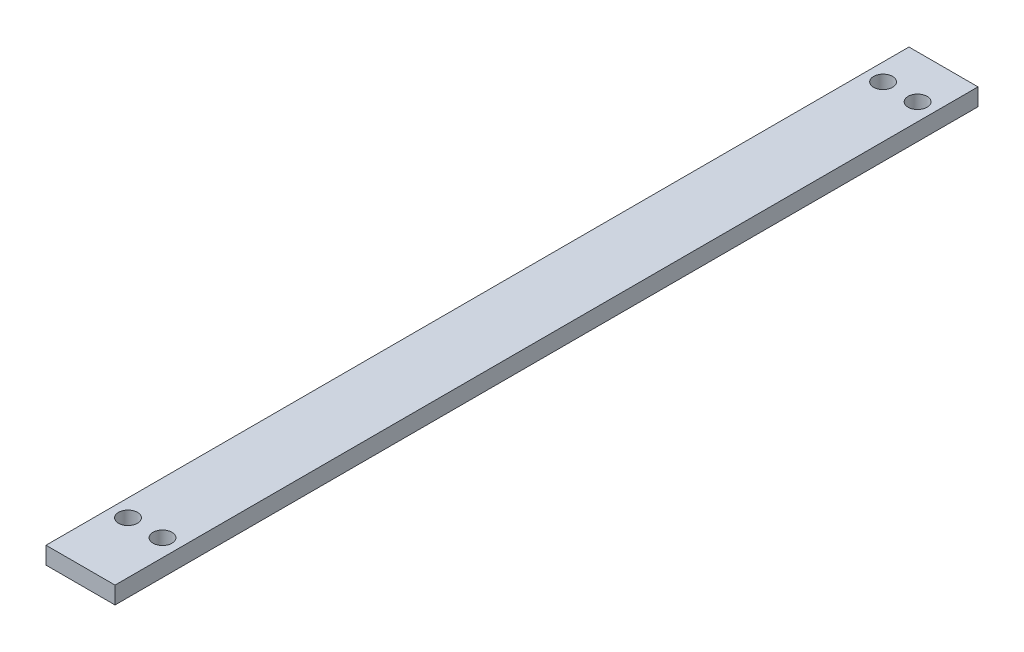
ISO-10303-21;
HEADER;
FILE_DESCRIPTION(('STEP AP214'),'2;1');
FILE_NAME('part.step','',(''),(''),'','','');
FILE_SCHEMA(('AUTOMOTIVE_DESIGN { 1 0 10303 214 1 1 1 1 }'));
ENDSEC;
DATA;
#1=APPLICATION_CONTEXT('core data for automotive mechanical design processes');
#2=APPLICATION_PROTOCOL_DEFINITION('international standard','automotive_design',2000,#1);
#3=PRODUCT_CONTEXT('',#1,'mechanical');
#4=PRODUCT('Part','Part','',(#3));
#5=PRODUCT_RELATED_PRODUCT_CATEGORY('part','',(#4));
#6=PRODUCT_DEFINITION_FORMATION('','',#4);
#7=PRODUCT_DEFINITION_CONTEXT('part definition',#1,'design');
#8=PRODUCT_DEFINITION('design','',#6,#7);
#9=PRODUCT_DEFINITION_SHAPE('','',#8);
#10=(LENGTH_UNIT() NAMED_UNIT(*) SI_UNIT(.MILLI.,.METRE.));
#11=(NAMED_UNIT(*) PLANE_ANGLE_UNIT() SI_UNIT($,.RADIAN.));
#12=(NAMED_UNIT(*) SI_UNIT($,.STERADIAN.) SOLID_ANGLE_UNIT());
#13=UNCERTAINTY_MEASURE_WITH_UNIT(LENGTH_MEASURE(1.E-05),#10,'distance_accuracy_value','');
#14=(GEOMETRIC_REPRESENTATION_CONTEXT(3) GLOBAL_UNCERTAINTY_ASSIGNED_CONTEXT((#13)) GLOBAL_UNIT_ASSIGNED_CONTEXT((#10,
#11,#12)) REPRESENTATION_CONTEXT('',''));
#15=CARTESIAN_POINT('',(0.,0.,0.));
#16=DIRECTION('',(0.,0.,1.));
#17=DIRECTION('',(1.,0.,0.));
#18=AXIS2_PLACEMENT_3D('',#15,#16,#17);
#19=CARTESIAN_POINT('',(0.,4.,0.));
#20=DIRECTION('',(-1.,0.,0.));
#21=DIRECTION('',(0.,0.,1.));
#22=AXIS2_PLACEMENT_3D('',#19,#20,#21);
#23=PLANE('',#22);
#24=DIRECTION('',(0.,0.,-1.));
#25=VECTOR('',#24,1.);
#26=CARTESIAN_POINT('',(0.,0.,0.));
#27=LINE('',#26,#25);
#28=CARTESIAN_POINT('',(0.,0.,0.));
#29=VERTEX_POINT('',#28);
#30=CARTESIAN_POINT('',(0.,0.,-200.));
#31=VERTEX_POINT('',#30);
#32=EDGE_CURVE('E131',#29,#31,#27,.T.);
#33=ORIENTED_EDGE('',*,*,#32,.F.);
#34=DIRECTION('',(0.,-1.,0.));
#35=VECTOR('',#34,1.);
#36=CARTESIAN_POINT('',(0.,4.,0.));
#37=LINE('',#36,#35);
#38=CARTESIAN_POINT('',(0.,4.,0.));
#39=VERTEX_POINT('',#38);
#40=EDGE_CURVE('E11',#39,#29,#37,.T.);
#41=ORIENTED_EDGE('',*,*,#40,.F.);
#42=DIRECTION('',(0.,0.,-1.));
#43=VECTOR('',#42,1.);
#44=CARTESIAN_POINT('',(0.,4.,0.));
#45=LINE('',#44,#43);
#46=CARTESIAN_POINT('',(0.,4.,-200.));
#47=VERTEX_POINT('',#46);
#48=EDGE_CURVE('E99',#39,#47,#45,.T.);
#49=ORIENTED_EDGE('',*,*,#48,.T.);
#50=DIRECTION('',(0.,-1.,0.));
#51=VECTOR('',#50,1.);
#52=CARTESIAN_POINT('',(0.,4.,-200.));
#53=LINE('',#52,#51);
#54=EDGE_CURVE('E59',#47,#31,#53,.T.);
#55=ORIENTED_EDGE('',*,*,#54,.T.);
#56=EDGE_LOOP('',(#33,#41,#49,#55));
#57=FACE_BOUND('',#56,.T.);
#58=ADVANCED_FACE('F41',(#57),#23,.T.);
#59=CARTESIAN_POINT('',(0.,4.,0.));
#60=DIRECTION('',(0.,0.,-1.));
#61=DIRECTION('',(-1.,0.,0.));
#62=AXIS2_PLACEMENT_3D('',#59,#60,#61);
#63=PLANE('',#62);
#64=DIRECTION('',(1.,0.,0.));
#65=VECTOR('',#64,1.);
#66=CARTESIAN_POINT('',(0.,0.,0.));
#67=LINE('',#66,#65);
#68=CARTESIAN_POINT('',(16.,0.,0.));
#69=VERTEX_POINT('',#68);
#70=EDGE_CURVE('E105',#29,#69,#67,.T.);
#71=ORIENTED_EDGE('',*,*,#70,.T.);
#72=DIRECTION('',(0.,-1.,0.));
#73=VECTOR('',#72,1.);
#74=CARTESIAN_POINT('',(16.,4.,0.));
#75=LINE('',#74,#73);
#76=CARTESIAN_POINT('',(16.,4.,0.));
#77=VERTEX_POINT('',#76);
#78=EDGE_CURVE('E51',#77,#69,#75,.T.);
#79=ORIENTED_EDGE('',*,*,#78,.F.);
#80=DIRECTION('',(1.,0.,0.));
#81=VECTOR('',#80,1.);
#82=CARTESIAN_POINT('',(0.,4.,0.));
#83=LINE('',#82,#81);
#84=EDGE_CURVE('E94',#39,#77,#83,.T.);
#85=ORIENTED_EDGE('',*,*,#84,.F.);
#86=ORIENTED_EDGE('',*,*,#40,.T.);
#87=EDGE_LOOP('',(#71,#79,#85,#86));
#88=FACE_BOUND('',#87,.T.);
#89=ADVANCED_FACE('F103',(#88),#63,.F.);
#90=CARTESIAN_POINT('',(16.,4.,0.));
#91=DIRECTION('',(-1.,0.,0.));
#92=DIRECTION('',(0.,0.,1.));
#93=AXIS2_PLACEMENT_3D('',#90,#91,#92);
#94=PLANE('',#93);
#95=DIRECTION('',(0.,0.,-1.));
#96=VECTOR('',#95,1.);
#97=CARTESIAN_POINT('',(16.,0.,0.));
#98=LINE('',#97,#96);
#99=CARTESIAN_POINT('',(16.,0.,-200.));
#100=VERTEX_POINT('',#99);
#101=EDGE_CURVE('E126',#69,#100,#98,.T.);
#102=ORIENTED_EDGE('',*,*,#101,.T.);
#103=DIRECTION('',(0.,-1.,0.));
#104=VECTOR('',#103,1.);
#105=CARTESIAN_POINT('',(16.,4.,-200.));
#106=LINE('',#105,#104);
#107=CARTESIAN_POINT('',(16.,4.,-200.));
#108=VERTEX_POINT('',#107);
#109=EDGE_CURVE('E73',#108,#100,#106,.T.);
#110=ORIENTED_EDGE('',*,*,#109,.F.);
#111=DIRECTION('',(0.,0.,-1.));
#112=VECTOR('',#111,1.);
#113=CARTESIAN_POINT('',(16.,4.,0.));
#114=LINE('',#113,#112);
#115=EDGE_CURVE('E85',#77,#108,#114,.T.);
#116=ORIENTED_EDGE('',*,*,#115,.F.);
#117=ORIENTED_EDGE('',*,*,#78,.T.);
#118=EDGE_LOOP('',(#102,#110,#116,#117));
#119=FACE_BOUND('',#118,.T.);
#120=ADVANCED_FACE('F87',(#119),#94,.F.);
#121=CARTESIAN_POINT('',(3.99999999999997,4.,-190.));
#122=DIRECTION('',(0.,-1.,0.));
#123=DIRECTION('',(0.,0.,-1.));
#124=AXIS2_PLACEMENT_3D('',#121,#122,#123);
#125=CYLINDRICAL_SURFACE('',#124,2.2);
#126=CARTESIAN_POINT('',(3.99999999999997,4.,-190.));
#127=DIRECTION('',(0.,1.,0.));
#128=DIRECTION('',(0.,0.,1.));
#129=AXIS2_PLACEMENT_3D('',#126,#127,#128);
#130=CIRCLE('',#129,2.2);
#131=CARTESIAN_POINT('',(3.99999999999997,4.,-187.8));
#132=VERTEX_POINT('',#131);
#133=EDGE_CURVE('E145',#132,#132,#130,.T.);
#134=ORIENTED_EDGE('',*,*,#133,.T.);
#135=EDGE_LOOP('',(#134));
#136=FACE_BOUND('',#135,.T.);
#137=CARTESIAN_POINT('',(3.99999999999997,0.,-190.));
#138=DIRECTION('',(0.,1.,0.));
#139=DIRECTION('',(0.,0.,1.));
#140=AXIS2_PLACEMENT_3D('',#137,#138,#139);
#141=CIRCLE('',#140,2.2);
#142=CARTESIAN_POINT('',(3.99999999999997,0.,-187.8));
#143=VERTEX_POINT('',#142);
#144=EDGE_CURVE('E118',#143,#143,#141,.T.);
#145=ORIENTED_EDGE('',*,*,#144,.F.);
#146=EDGE_LOOP('',(#145));
#147=FACE_BOUND('',#146,.T.);
#148=ADVANCED_FACE('F201',(#136,#147),#125,.F.);
#149=CARTESIAN_POINT('',(0.,4.,-200.));
#150=DIRECTION('',(0.,0.,-1.));
#151=DIRECTION('',(-1.,0.,0.));
#152=AXIS2_PLACEMENT_3D('',#149,#150,#151);
#153=PLANE('',#152);
#154=DIRECTION('',(1.,0.,0.));
#155=VECTOR('',#154,1.);
#156=CARTESIAN_POINT('',(0.,0.,-200.));
#157=LINE('',#156,#155);
#158=EDGE_CURVE('E122',#31,#100,#157,.T.);
#159=ORIENTED_EDGE('',*,*,#158,.F.);
#160=ORIENTED_EDGE('',*,*,#54,.F.);
#161=DIRECTION('',(1.,0.,0.));
#162=VECTOR('',#161,1.);
#163=CARTESIAN_POINT('',(0.,4.,-200.));
#164=LINE('',#163,#162);
#165=EDGE_CURVE('E93',#47,#108,#164,.T.);
#166=ORIENTED_EDGE('',*,*,#165,.T.);
#167=ORIENTED_EDGE('',*,*,#109,.T.);
#168=EDGE_LOOP('',(#159,#160,#166,#167));
#169=FACE_BOUND('',#168,.T.);
#170=ADVANCED_FACE('F173',(#169),#153,.T.);
#171=CARTESIAN_POINT('',(3.99999999999997,4.,-15.));
#172=DIRECTION('',(0.,-1.,0.));
#173=DIRECTION('',(0.,0.,-1.));
#174=AXIS2_PLACEMENT_3D('',#171,#172,#173);
#175=CYLINDRICAL_SURFACE('',#174,2.2);
#176=CARTESIAN_POINT('',(3.99999999999997,4.,-15.));
#177=DIRECTION('',(0.,1.,0.));
#178=DIRECTION('',(0.,0.,1.));
#179=AXIS2_PLACEMENT_3D('',#176,#177,#178);
#180=CIRCLE('',#179,2.2);
#181=CARTESIAN_POINT('',(3.99999999999997,4.,-12.8));
#182=VERTEX_POINT('',#181);
#183=EDGE_CURVE('E153',#182,#182,#180,.T.);
#184=ORIENTED_EDGE('',*,*,#183,.T.);
#185=EDGE_LOOP('',(#184));
#186=FACE_BOUND('',#185,.T.);
#187=CARTESIAN_POINT('',(3.99999999999997,0.,-15.));
#188=DIRECTION('',(0.,1.,0.));
#189=DIRECTION('',(0.,0.,1.));
#190=AXIS2_PLACEMENT_3D('',#187,#188,#189);
#191=CIRCLE('',#190,2.2);
#192=CARTESIAN_POINT('',(3.99999999999997,0.,-12.8));
#193=VERTEX_POINT('',#192);
#194=EDGE_CURVE('E134',#193,#193,#191,.T.);
#195=ORIENTED_EDGE('',*,*,#194,.F.);
#196=EDGE_LOOP('',(#195));
#197=FACE_BOUND('',#196,.T.);
#198=ADVANCED_FACE('F170',(#186,#197),#175,.F.);
#199=CARTESIAN_POINT('',(12.,4.,-15.));
#200=DIRECTION('',(0.,-1.,0.));
#201=DIRECTION('',(0.,0.,-1.));
#202=AXIS2_PLACEMENT_3D('',#199,#200,#201);
#203=CYLINDRICAL_SURFACE('',#202,2.2);
#204=CARTESIAN_POINT('',(12.,4.,-15.));
#205=DIRECTION('',(0.,1.,0.));
#206=DIRECTION('',(0.,0.,1.));
#207=AXIS2_PLACEMENT_3D('',#204,#205,#206);
#208=CIRCLE('',#207,2.2);
#209=CARTESIAN_POINT('',(12.,4.,-12.8));
#210=VERTEX_POINT('',#209);
#211=EDGE_CURVE('E117',#210,#210,#208,.T.);
#212=ORIENTED_EDGE('',*,*,#211,.T.);
#213=EDGE_LOOP('',(#212));
#214=FACE_BOUND('',#213,.T.);
#215=CARTESIAN_POINT('',(12.,0.,-15.));
#216=DIRECTION('',(0.,1.,0.));
#217=DIRECTION('',(0.,0.,1.));
#218=AXIS2_PLACEMENT_3D('',#215,#216,#217);
#219=CIRCLE('',#218,2.2);
#220=CARTESIAN_POINT('',(12.,0.,-12.8));
#221=VERTEX_POINT('',#220);
#222=EDGE_CURVE('E138',#221,#221,#219,.T.);
#223=ORIENTED_EDGE('',*,*,#222,.F.);
#224=EDGE_LOOP('',(#223));
#225=FACE_BOUND('',#224,.T.);
#226=ADVANCED_FACE('F43',(#214,#225),#203,.F.);
#227=CARTESIAN_POINT('',(12.,4.,-190.));
#228=DIRECTION('',(0.,-1.,0.));
#229=DIRECTION('',(0.,0.,-1.));
#230=AXIS2_PLACEMENT_3D('',#227,#228,#229);
#231=CYLINDRICAL_SURFACE('',#230,2.2);
#232=CARTESIAN_POINT('',(12.,4.,-190.));
#233=DIRECTION('',(0.,1.,0.));
#234=DIRECTION('',(0.,0.,1.));
#235=AXIS2_PLACEMENT_3D('',#232,#233,#234);
#236=CIRCLE('',#235,2.2);
#237=CARTESIAN_POINT('',(12.,4.,-187.8));
#238=VERTEX_POINT('',#237);
#239=EDGE_CURVE('E112',#238,#238,#236,.T.);
#240=ORIENTED_EDGE('',*,*,#239,.T.);
#241=EDGE_LOOP('',(#240));
#242=FACE_BOUND('',#241,.T.);
#243=CARTESIAN_POINT('',(12.,0.,-190.));
#244=DIRECTION('',(0.,1.,0.));
#245=DIRECTION('',(0.,0.,1.));
#246=AXIS2_PLACEMENT_3D('',#243,#244,#245);
#247=CIRCLE('',#246,2.2);
#248=CARTESIAN_POINT('',(12.,0.,-187.8));
#249=VERTEX_POINT('',#248);
#250=EDGE_CURVE('E113',#249,#249,#247,.T.);
#251=ORIENTED_EDGE('',*,*,#250,.F.);
#252=EDGE_LOOP('',(#251));
#253=FACE_BOUND('',#252,.T.);
#254=ADVANCED_FACE('F166',(#242,#253),#231,.F.);
#255=CARTESIAN_POINT('',(0.,4.,0.));
#256=DIRECTION('',(0.,1.,0.));
#257=DIRECTION('',(0.,0.,1.));
#258=AXIS2_PLACEMENT_3D('',#255,#256,#257);
#259=PLANE('',#258);
#260=ORIENTED_EDGE('',*,*,#211,.F.);
#261=EDGE_LOOP('',(#260));
#262=FACE_BOUND('',#261,.T.);
#263=ORIENTED_EDGE('',*,*,#183,.F.);
#264=EDGE_LOOP('',(#263));
#265=FACE_BOUND('',#264,.T.);
#266=ORIENTED_EDGE('',*,*,#48,.F.);
#267=ORIENTED_EDGE('',*,*,#84,.T.);
#268=ORIENTED_EDGE('',*,*,#115,.T.);
#269=ORIENTED_EDGE('',*,*,#165,.F.);
#270=EDGE_LOOP('',(#266,#267,#268,#269));
#271=FACE_BOUND('',#270,.T.);
#272=ORIENTED_EDGE('',*,*,#133,.F.);
#273=EDGE_LOOP('',(#272));
#274=FACE_BOUND('',#273,.T.);
#275=ORIENTED_EDGE('',*,*,#239,.F.);
#276=EDGE_LOOP('',(#275));
#277=FACE_BOUND('',#276,.T.);
#278=ADVANCED_FACE('F97',(#262,#265,#271,#274,#277),#259,.T.);
#279=CARTESIAN_POINT('',(0.,0.,0.));
#280=DIRECTION('',(0.,1.,0.));
#281=DIRECTION('',(0.,0.,1.));
#282=AXIS2_PLACEMENT_3D('',#279,#280,#281);
#283=PLANE('',#282);
#284=ORIENTED_EDGE('',*,*,#222,.T.);
#285=EDGE_LOOP('',(#284));
#286=FACE_BOUND('',#285,.T.);
#287=ORIENTED_EDGE('',*,*,#194,.T.);
#288=EDGE_LOOP('',(#287));
#289=FACE_BOUND('',#288,.T.);
#290=ORIENTED_EDGE('',*,*,#32,.T.);
#291=ORIENTED_EDGE('',*,*,#158,.T.);
#292=ORIENTED_EDGE('',*,*,#101,.F.);
#293=ORIENTED_EDGE('',*,*,#70,.F.);
#294=EDGE_LOOP('',(#290,#291,#292,#293));
#295=FACE_BOUND('',#294,.T.);
#296=ORIENTED_EDGE('',*,*,#144,.T.);
#297=EDGE_LOOP('',(#296));
#298=FACE_BOUND('',#297,.T.);
#299=ORIENTED_EDGE('',*,*,#250,.T.);
#300=EDGE_LOOP('',(#299));
#301=FACE_BOUND('',#300,.T.);
#302=ADVANCED_FACE('F165',(#286,#289,#295,#298,#301),#283,.F.);
#303=CLOSED_SHELL('',(#58,#89,#120,#148,#170,#198,#226,#254,#278,#302));
#304=MANIFOLD_SOLID_BREP('B2',#303);
#305=ADVANCED_BREP_SHAPE_REPRESENTATION('',(#18,#304),#14);
#306=SHAPE_DEFINITION_REPRESENTATION(#9,#305);
ENDSEC;
END-ISO-10303-21;
